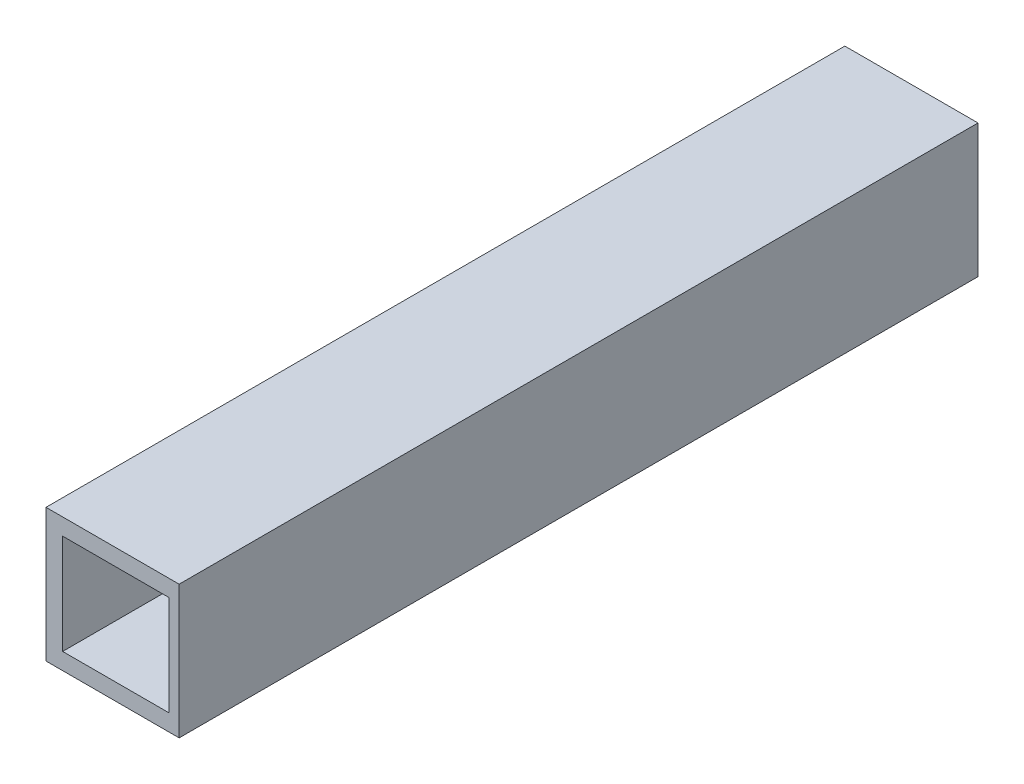
ISO-10303-21;
HEADER;
FILE_DESCRIPTION(('STEP AP214'),'2;1');
FILE_NAME('part.step','',(''),(''),'','','');
FILE_SCHEMA(('AUTOMOTIVE_DESIGN { 1 0 10303 214 1 1 1 1 }'));
ENDSEC;
DATA;
#1=APPLICATION_CONTEXT('core data for automotive mechanical design processes');
#2=APPLICATION_PROTOCOL_DEFINITION('international standard','automotive_design',2000,#1);
#3=PRODUCT_CONTEXT('',#1,'mechanical');
#4=PRODUCT('Part','Part','',(#3));
#5=PRODUCT_RELATED_PRODUCT_CATEGORY('part','',(#4));
#6=PRODUCT_DEFINITION_FORMATION('','',#4);
#7=PRODUCT_DEFINITION_CONTEXT('part definition',#1,'design');
#8=PRODUCT_DEFINITION('design','',#6,#7);
#9=PRODUCT_DEFINITION_SHAPE('','',#8);
#10=(LENGTH_UNIT() NAMED_UNIT(*) SI_UNIT(.MILLI.,.METRE.));
#11=(NAMED_UNIT(*) PLANE_ANGLE_UNIT() SI_UNIT($,.RADIAN.));
#12=(NAMED_UNIT(*) SI_UNIT($,.STERADIAN.) SOLID_ANGLE_UNIT());
#13=UNCERTAINTY_MEASURE_WITH_UNIT(LENGTH_MEASURE(1.E-05),#10,'distance_accuracy_value','');
#14=(GEOMETRIC_REPRESENTATION_CONTEXT(3) GLOBAL_UNCERTAINTY_ASSIGNED_CONTEXT((#13)) GLOBAL_UNIT_ASSIGNED_CONTEXT((#10,
#11,#12)) REPRESENTATION_CONTEXT('',''));
#15=CARTESIAN_POINT('',(0.,0.,0.));
#16=DIRECTION('',(0.,0.,1.));
#17=DIRECTION('',(1.,0.,0.));
#18=AXIS2_PLACEMENT_3D('',#15,#16,#17);
#19=CARTESIAN_POINT('',(0.,0.,152.4));
#20=DIRECTION('',(-1.,0.,0.));
#21=DIRECTION('',(0.,-1.,0.));
#22=AXIS2_PLACEMENT_3D('',#19,#20,#21);
#23=PLANE('',#22);
#24=DIRECTION('',(0.,1.,0.));
#25=VECTOR('',#24,1.);
#26=CARTESIAN_POINT('',(0.,0.,0.));
#27=LINE('',#26,#25);
#28=CARTESIAN_POINT('',(0.,0.,0.));
#29=VERTEX_POINT('',#28);
#30=CARTESIAN_POINT('',(0.,25.4,0.));
#31=VERTEX_POINT('',#30);
#32=EDGE_CURVE('E148',#29,#31,#27,.T.);
#33=ORIENTED_EDGE('',*,*,#32,.F.);
#34=DIRECTION('',(0.,0.,-1.));
#35=VECTOR('',#34,1.);
#36=CARTESIAN_POINT('',(0.,0.,152.4));
#37=LINE('',#36,#35);
#38=CARTESIAN_POINT('',(0.,0.,152.4));
#39=VERTEX_POINT('',#38);
#40=EDGE_CURVE('E11',#39,#29,#37,.T.);
#41=ORIENTED_EDGE('',*,*,#40,.F.);
#42=DIRECTION('',(0.,1.,0.));
#43=VECTOR('',#42,1.);
#44=CARTESIAN_POINT('',(0.,0.,152.4));
#45=LINE('',#44,#43);
#46=CARTESIAN_POINT('',(0.,25.4,152.4));
#47=VERTEX_POINT('',#46);
#48=EDGE_CURVE('E154',#39,#47,#45,.T.);
#49=ORIENTED_EDGE('',*,*,#48,.T.);
#50=DIRECTION('',(0.,0.,-1.));
#51=VECTOR('',#50,1.);
#52=CARTESIAN_POINT('',(0.,25.4,152.4));
#53=LINE('',#52,#51);
#54=EDGE_CURVE('E42',#47,#31,#53,.T.);
#55=ORIENTED_EDGE('',*,*,#54,.T.);
#56=EDGE_LOOP('',(#33,#41,#49,#55));
#57=FACE_BOUND('',#56,.T.);
#58=ADVANCED_FACE('F39',(#57),#23,.T.);
#59=CARTESIAN_POINT('',(0.,0.,152.4));
#60=DIRECTION('',(0.,1.,0.));
#61=DIRECTION('',(0.,0.,1.));
#62=AXIS2_PLACEMENT_3D('',#59,#60,#61);
#63=PLANE('',#62);
#64=DIRECTION('',(1.,0.,0.));
#65=VECTOR('',#64,1.);
#66=CARTESIAN_POINT('',(0.,0.,0.));
#67=LINE('',#66,#65);
#68=CARTESIAN_POINT('',(25.4,0.,0.));
#69=VERTEX_POINT('',#68);
#70=EDGE_CURVE('E159',#29,#69,#67,.T.);
#71=ORIENTED_EDGE('',*,*,#70,.T.);
#72=DIRECTION('',(0.,0.,-1.));
#73=VECTOR('',#72,1.);
#74=CARTESIAN_POINT('',(25.4,0.,152.4));
#75=LINE('',#74,#73);
#76=CARTESIAN_POINT('',(25.4,0.,152.4));
#77=VERTEX_POINT('',#76);
#78=EDGE_CURVE('E48',#77,#69,#75,.T.);
#79=ORIENTED_EDGE('',*,*,#78,.F.);
#80=DIRECTION('',(1.,0.,0.));
#81=VECTOR('',#80,1.);
#82=CARTESIAN_POINT('',(0.,0.,152.4));
#83=LINE('',#82,#81);
#84=EDGE_CURVE('E166',#39,#77,#83,.T.);
#85=ORIENTED_EDGE('',*,*,#84,.F.);
#86=ORIENTED_EDGE('',*,*,#40,.T.);
#87=EDGE_LOOP('',(#71,#79,#85,#86));
#88=FACE_BOUND('',#87,.T.);
#89=ADVANCED_FACE('F201',(#88),#63,.F.);
#90=CARTESIAN_POINT('',(25.4,0.,152.4));
#91=DIRECTION('',(-1.,0.,0.));
#92=DIRECTION('',(0.,-1.,0.));
#93=AXIS2_PLACEMENT_3D('',#90,#91,#92);
#94=PLANE('',#93);
#95=DIRECTION('',(0.,1.,0.));
#96=VECTOR('',#95,1.);
#97=CARTESIAN_POINT('',(25.4,0.,0.));
#98=LINE('',#97,#96);
#99=CARTESIAN_POINT('',(25.4,25.4,0.));
#100=VERTEX_POINT('',#99);
#101=EDGE_CURVE('E176',#69,#100,#98,.T.);
#102=ORIENTED_EDGE('',*,*,#101,.T.);
#103=DIRECTION('',(0.,0.,-1.));
#104=VECTOR('',#103,1.);
#105=CARTESIAN_POINT('',(25.4,25.4,152.4));
#106=LINE('',#105,#104);
#107=CARTESIAN_POINT('',(25.4,25.4,152.4));
#108=VERTEX_POINT('',#107);
#109=EDGE_CURVE('E184',#108,#100,#106,.T.);
#110=ORIENTED_EDGE('',*,*,#109,.F.);
#111=DIRECTION('',(0.,1.,0.));
#112=VECTOR('',#111,1.);
#113=CARTESIAN_POINT('',(25.4,0.,152.4));
#114=LINE('',#113,#112);
#115=EDGE_CURVE('E163',#77,#108,#114,.T.);
#116=ORIENTED_EDGE('',*,*,#115,.F.);
#117=ORIENTED_EDGE('',*,*,#78,.T.);
#118=EDGE_LOOP('',(#102,#110,#116,#117));
#119=FACE_BOUND('',#118,.T.);
#120=ADVANCED_FACE('F205',(#119),#94,.F.);
#121=CARTESIAN_POINT('',(0.,25.4,152.4));
#122=DIRECTION('',(0.,1.,0.));
#123=DIRECTION('',(0.,0.,1.));
#124=AXIS2_PLACEMENT_3D('',#121,#122,#123);
#125=PLANE('',#124);
#126=DIRECTION('',(1.,0.,0.));
#127=VECTOR('',#126,1.);
#128=CARTESIAN_POINT('',(0.,25.4,0.));
#129=LINE('',#128,#127);
#130=EDGE_CURVE('E172',#31,#100,#129,.T.);
#131=ORIENTED_EDGE('',*,*,#130,.F.);
#132=ORIENTED_EDGE('',*,*,#54,.F.);
#133=DIRECTION('',(1.,0.,0.));
#134=VECTOR('',#133,1.);
#135=CARTESIAN_POINT('',(0.,25.4,152.4));
#136=LINE('',#135,#134);
#137=EDGE_CURVE('E158',#47,#108,#136,.T.);
#138=ORIENTED_EDGE('',*,*,#137,.T.);
#139=ORIENTED_EDGE('',*,*,#109,.T.);
#140=EDGE_LOOP('',(#131,#132,#138,#139));
#141=FACE_BOUND('',#140,.T.);
#142=ADVANCED_FACE('F194',(#141),#125,.T.);
#143=CARTESIAN_POINT('',(0.,0.,152.4));
#144=DIRECTION('',(0.,0.,-1.));
#145=DIRECTION('',(-1.,0.,0.));
#146=AXIS2_PLACEMENT_3D('',#143,#144,#145);
#147=PLANE('',#146);
#148=DIRECTION('',(1.,0.,0.));
#149=VECTOR('',#148,1.);
#150=CARTESIAN_POINT('',(23.4777661909682,22.225,152.4));
#151=LINE('',#150,#149);
#152=CARTESIAN_POINT('',(3.175,22.225,152.4));
#153=VERTEX_POINT('',#152);
#154=CARTESIAN_POINT('',(23.4777661909682,22.225,152.4));
#155=VERTEX_POINT('',#154);
#156=EDGE_CURVE('E114',#153,#155,#151,.T.);
#157=ORIENTED_EDGE('',*,*,#156,.T.);
#158=DIRECTION('',(0.,-1.,0.));
#159=VECTOR('',#158,1.);
#160=CARTESIAN_POINT('',(23.4777661909682,22.225,152.4));
#161=LINE('',#160,#159);
#162=CARTESIAN_POINT('',(23.4777661909682,3.175,152.4));
#163=VERTEX_POINT('',#162);
#164=EDGE_CURVE('E107',#155,#163,#161,.T.);
#165=ORIENTED_EDGE('',*,*,#164,.T.);
#166=DIRECTION('',(-1.,0.,0.));
#167=VECTOR('',#166,1.);
#168=CARTESIAN_POINT('',(23.4777661909682,3.175,152.4));
#169=LINE('',#168,#167);
#170=CARTESIAN_POINT('',(3.175,3.175,152.4));
#171=VERTEX_POINT('',#170);
#172=EDGE_CURVE('E117',#163,#171,#169,.T.);
#173=ORIENTED_EDGE('',*,*,#172,.T.);
#174=DIRECTION('',(0.,1.,0.));
#175=VECTOR('',#174,1.);
#176=CARTESIAN_POINT('',(3.175,22.225,152.4));
#177=LINE('',#176,#175);
#178=EDGE_CURVE('E56',#171,#153,#177,.T.);
#179=ORIENTED_EDGE('',*,*,#178,.T.);
#180=EDGE_LOOP('',(#157,#165,#173,#179));
#181=FACE_BOUND('',#180,.T.);
#182=ORIENTED_EDGE('',*,*,#48,.F.);
#183=ORIENTED_EDGE('',*,*,#84,.T.);
#184=ORIENTED_EDGE('',*,*,#115,.T.);
#185=ORIENTED_EDGE('',*,*,#137,.F.);
#186=EDGE_LOOP('',(#182,#183,#184,#185));
#187=FACE_BOUND('',#186,.T.);
#188=ADVANCED_FACE('F122',(#181,#187),#147,.F.);
#189=CARTESIAN_POINT('',(0.,0.,0.));
#190=DIRECTION('',(0.,0.,-1.));
#191=DIRECTION('',(-1.,0.,0.));
#192=AXIS2_PLACEMENT_3D('',#189,#190,#191);
#193=PLANE('',#192);
#194=DIRECTION('',(0.,-1.,0.));
#195=VECTOR('',#194,1.);
#196=CARTESIAN_POINT('',(23.4777661909682,22.225,0.));
#197=LINE('',#196,#195);
#198=CARTESIAN_POINT('',(23.4777661909682,22.225,0.));
#199=VERTEX_POINT('',#198);
#200=CARTESIAN_POINT('',(23.4777661909682,3.175,0.));
#201=VERTEX_POINT('',#200);
#202=EDGE_CURVE('E64',#199,#201,#197,.T.);
#203=ORIENTED_EDGE('',*,*,#202,.F.);
#204=DIRECTION('',(1.,0.,0.));
#205=VECTOR('',#204,1.);
#206=CARTESIAN_POINT('',(23.4777661909682,22.225,0.));
#207=LINE('',#206,#205);
#208=CARTESIAN_POINT('',(3.175,22.225,0.));
#209=VERTEX_POINT('',#208);
#210=EDGE_CURVE('E126',#209,#199,#207,.T.);
#211=ORIENTED_EDGE('',*,*,#210,.F.);
#212=DIRECTION('',(0.,1.,0.));
#213=VECTOR('',#212,1.);
#214=CARTESIAN_POINT('',(3.175,22.225,0.));
#215=LINE('',#214,#213);
#216=CARTESIAN_POINT('',(3.175,3.175,0.));
#217=VERTEX_POINT('',#216);
#218=EDGE_CURVE('E130',#217,#209,#215,.T.);
#219=ORIENTED_EDGE('',*,*,#218,.F.);
#220=DIRECTION('',(-1.,0.,0.));
#221=VECTOR('',#220,1.);
#222=CARTESIAN_POINT('',(23.4777661909682,3.175,0.));
#223=LINE('',#222,#221);
#224=EDGE_CURVE('E139',#201,#217,#223,.T.);
#225=ORIENTED_EDGE('',*,*,#224,.F.);
#226=EDGE_LOOP('',(#203,#211,#219,#225));
#227=FACE_BOUND('',#226,.T.);
#228=ORIENTED_EDGE('',*,*,#32,.T.);
#229=ORIENTED_EDGE('',*,*,#130,.T.);
#230=ORIENTED_EDGE('',*,*,#101,.F.);
#231=ORIENTED_EDGE('',*,*,#70,.F.);
#232=EDGE_LOOP('',(#228,#229,#230,#231));
#233=FACE_BOUND('',#232,.T.);
#234=ADVANCED_FACE('F198',(#227,#233),#193,.T.);
#235=CARTESIAN_POINT('',(23.4777661909682,22.225,152.4));
#236=DIRECTION('',(1.,0.,0.));
#237=DIRECTION('',(0.,1.,0.));
#238=AXIS2_PLACEMENT_3D('',#235,#236,#237);
#239=PLANE('',#238);
#240=ORIENTED_EDGE('',*,*,#202,.T.);
#241=DIRECTION('',(0.,0.,-1.));
#242=VECTOR('',#241,1.);
#243=CARTESIAN_POINT('',(23.4777661909682,3.175,152.4));
#244=LINE('',#243,#242);
#245=EDGE_CURVE('E103',#163,#201,#244,.T.);
#246=ORIENTED_EDGE('',*,*,#245,.F.);
#247=ORIENTED_EDGE('',*,*,#164,.F.);
#248=DIRECTION('',(0.,0.,-1.));
#249=VECTOR('',#248,1.);
#250=CARTESIAN_POINT('',(23.4777661909682,22.225,152.4));
#251=LINE('',#250,#249);
#252=EDGE_CURVE('E145',#155,#199,#251,.T.);
#253=ORIENTED_EDGE('',*,*,#252,.T.);
#254=EDGE_LOOP('',(#240,#246,#247,#253));
#255=FACE_BOUND('',#254,.T.);
#256=ADVANCED_FACE('F105',(#255),#239,.F.);
#257=CARTESIAN_POINT('',(23.4777661909682,22.225,152.4));
#258=DIRECTION('',(0.,1.,0.));
#259=DIRECTION('',(0.,0.,1.));
#260=AXIS2_PLACEMENT_3D('',#257,#258,#259);
#261=PLANE('',#260);
#262=ORIENTED_EDGE('',*,*,#210,.T.);
#263=ORIENTED_EDGE('',*,*,#252,.F.);
#264=ORIENTED_EDGE('',*,*,#156,.F.);
#265=DIRECTION('',(0.,0.,-1.));
#266=VECTOR('',#265,1.);
#267=CARTESIAN_POINT('',(3.175,22.225,152.4));
#268=LINE('',#267,#266);
#269=EDGE_CURVE('E149',#153,#209,#268,.T.);
#270=ORIENTED_EDGE('',*,*,#269,.T.);
#271=EDGE_LOOP('',(#262,#263,#264,#270));
#272=FACE_BOUND('',#271,.T.);
#273=ADVANCED_FACE('F249',(#272),#261,.F.);
#274=CARTESIAN_POINT('',(3.175,22.225,152.4));
#275=DIRECTION('',(-1.,0.,0.));
#276=DIRECTION('',(0.,-1.,0.));
#277=AXIS2_PLACEMENT_3D('',#274,#275,#276);
#278=PLANE('',#277);
#279=ORIENTED_EDGE('',*,*,#218,.T.);
#280=ORIENTED_EDGE('',*,*,#269,.F.);
#281=ORIENTED_EDGE('',*,*,#178,.F.);
#282=DIRECTION('',(0.,0.,-1.));
#283=VECTOR('',#282,1.);
#284=CARTESIAN_POINT('',(3.175,3.175,152.4));
#285=LINE('',#284,#283);
#286=EDGE_CURVE('E113',#171,#217,#285,.T.);
#287=ORIENTED_EDGE('',*,*,#286,.T.);
#288=EDGE_LOOP('',(#279,#280,#281,#287));
#289=FACE_BOUND('',#288,.T.);
#290=ADVANCED_FACE('F257',(#289),#278,.F.);
#291=CARTESIAN_POINT('',(23.4777661909682,3.175,152.4));
#292=DIRECTION('',(0.,-1.,0.));
#293=DIRECTION('',(0.,0.,-1.));
#294=AXIS2_PLACEMENT_3D('',#291,#292,#293);
#295=PLANE('',#294);
#296=ORIENTED_EDGE('',*,*,#224,.T.);
#297=ORIENTED_EDGE('',*,*,#286,.F.);
#298=ORIENTED_EDGE('',*,*,#172,.F.);
#299=ORIENTED_EDGE('',*,*,#245,.T.);
#300=EDGE_LOOP('',(#296,#297,#298,#299));
#301=FACE_BOUND('',#300,.T.);
#302=ADVANCED_FACE('F118',(#301),#295,.F.);
#303=CLOSED_SHELL('',(#58,#89,#120,#142,#188,#234,#256,#273,#290,#302));
#304=MANIFOLD_SOLID_BREP('B2',#303);
#305=ADVANCED_BREP_SHAPE_REPRESENTATION('',(#18,#304),#14);
#306=SHAPE_DEFINITION_REPRESENTATION(#9,#305);
ENDSEC;
END-ISO-10303-21;
